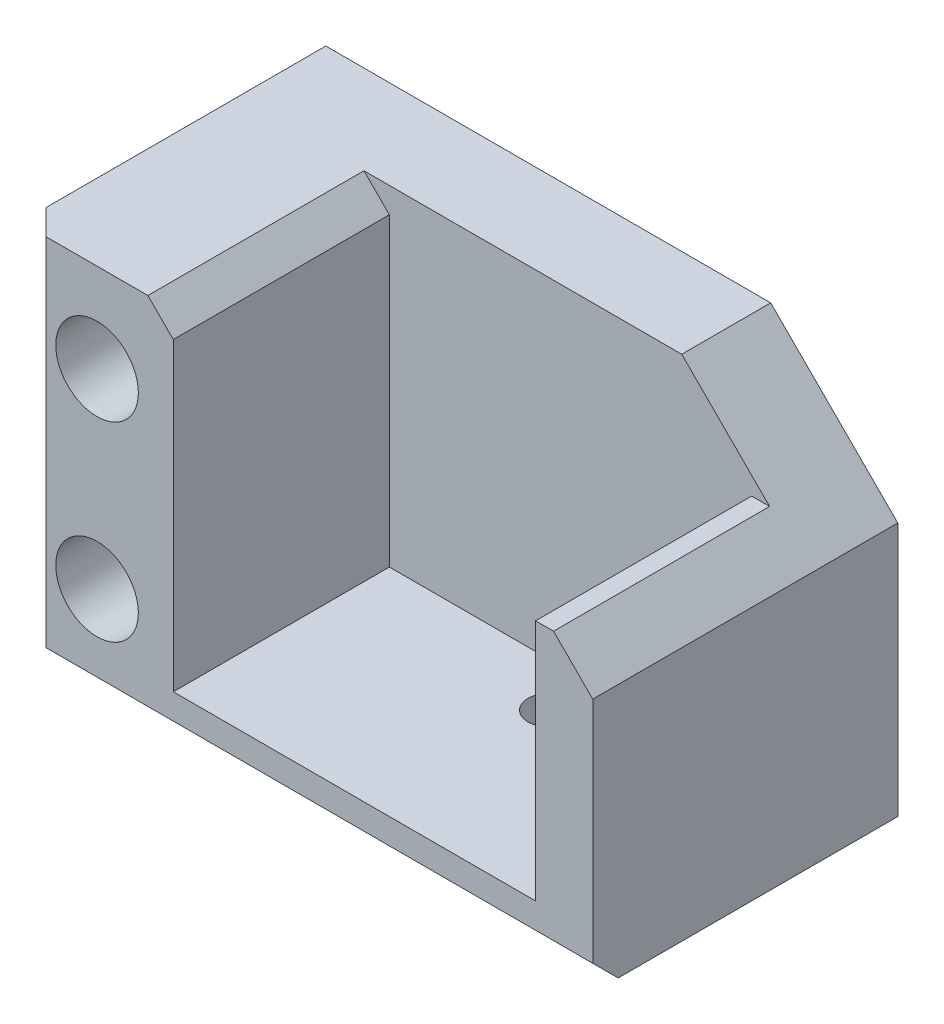
ISO-10303-21;
HEADER;
FILE_DESCRIPTION(('STEP AP214'),'2;1');
FILE_NAME('part.step','',(''),(''),'','','');
FILE_SCHEMA(('AUTOMOTIVE_DESIGN { 1 0 10303 214 1 1 1 1 }'));
ENDSEC;
DATA;
#1=APPLICATION_CONTEXT('core data for automotive mechanical design processes');
#2=APPLICATION_PROTOCOL_DEFINITION('international standard','automotive_design',2000,#1);
#3=PRODUCT_CONTEXT('',#1,'mechanical');
#4=PRODUCT('Part','Part','',(#3));
#5=PRODUCT_RELATED_PRODUCT_CATEGORY('part','',(#4));
#6=PRODUCT_DEFINITION_FORMATION('','',#4);
#7=PRODUCT_DEFINITION_CONTEXT('part definition',#1,'design');
#8=PRODUCT_DEFINITION('design','',#6,#7);
#9=PRODUCT_DEFINITION_SHAPE('','',#8);
#10=(LENGTH_UNIT() NAMED_UNIT(*) SI_UNIT(.MILLI.,.METRE.));
#11=(NAMED_UNIT(*) PLANE_ANGLE_UNIT() SI_UNIT($,.RADIAN.));
#12=(NAMED_UNIT(*) SI_UNIT($,.STERADIAN.) SOLID_ANGLE_UNIT());
#13=UNCERTAINTY_MEASURE_WITH_UNIT(LENGTH_MEASURE(1.E-05),#10,'distance_accuracy_value','');
#14=(GEOMETRIC_REPRESENTATION_CONTEXT(3) GLOBAL_UNCERTAINTY_ASSIGNED_CONTEXT((#13)) GLOBAL_UNIT_ASSIGNED_CONTEXT((#10,
#11,#12)) REPRESENTATION_CONTEXT('',''));
#15=CARTESIAN_POINT('',(0.,0.,0.));
#16=DIRECTION('',(0.,0.,1.));
#17=DIRECTION('',(1.,0.,0.));
#18=AXIS2_PLACEMENT_3D('',#15,#16,#17);
#19=CARTESIAN_POINT('',(6.00000202653794,6.00000000000019,-3.));
#20=DIRECTION('',(0.,-1.,0.));
#21=DIRECTION('',(1.,0.,0.));
#22=AXIS2_PLACEMENT_3D('',#19,#20,#21);
#23=PLANE('',#22);
#24=CARTESIAN_POINT('',(34.0000020265379,6.00000000000019,7.5));
#25=DIRECTION('',(0.,1.,0.));
#26=DIRECTION('',(0.,0.,1.));
#27=AXIS2_PLACEMENT_3D('',#24,#25,#26);
#28=CIRCLE('',#27,1.59999999999998);
#29=CARTESIAN_POINT('',(34.0000020265379,6.00000000000019,9.09999999999998));
#30=VERTEX_POINT('',#29);
#31=EDGE_CURVE('E272',#30,#30,#28,.T.);
#32=ORIENTED_EDGE('',*,*,#31,.T.);
#33=EDGE_LOOP('',(#32));
#34=FACE_BOUND('',#33,.T.);
#35=DIRECTION('',(0.,0.,1.));
#36=VECTOR('',#35,1.);
#37=CARTESIAN_POINT('',(51.0000020265379,6.00000000000023,-3.));
#38=LINE('',#37,#36);
#39=CARTESIAN_POINT('',(51.0000020265379,6.00000000000023,-3.));
#40=VERTEX_POINT('',#39);
#41=CARTESIAN_POINT('',(51.0000020265379,6.00000000000023,19.));
#42=VERTEX_POINT('',#41);
#43=EDGE_CURVE('E179',#40,#42,#38,.T.);
#44=ORIENTED_EDGE('',*,*,#43,.T.);
#45=DIRECTION('',(-1.,0.,0.));
#46=VECTOR('',#45,1.);
#47=CARTESIAN_POINT('',(6.00000202653794,6.00000000000019,19.));
#48=LINE('',#47,#46);
#49=CARTESIAN_POINT('',(6.00000202653794,6.00000000000019,19.));
#50=VERTEX_POINT('',#49);
#51=EDGE_CURVE('E207',#42,#50,#48,.T.);
#52=ORIENTED_EDGE('',*,*,#51,.T.);
#53=DIRECTION('',(0.,0.,1.));
#54=VECTOR('',#53,1.);
#55=CARTESIAN_POINT('',(6.00000202653794,6.00000000000019,-3.));
#56=LINE('',#55,#54);
#57=CARTESIAN_POINT('',(6.00000202653794,6.00000000000019,-3.));
#58=VERTEX_POINT('',#57);
#59=EDGE_CURVE('E183',#58,#50,#56,.T.);
#60=ORIENTED_EDGE('',*,*,#59,.F.);
#61=DIRECTION('',(1.,0.,0.));
#62=VECTOR('',#61,1.);
#63=CARTESIAN_POINT('',(6.00000202653794,6.00000000000019,-3.));
#64=LINE('',#63,#62);
#65=EDGE_CURVE('E167',#58,#40,#64,.T.);
#66=ORIENTED_EDGE('',*,*,#65,.T.);
#67=EDGE_LOOP('',(#44,#52,#60,#66));
#68=FACE_BOUND('',#67,.T.);
#69=ADVANCED_FACE('F33',(#34,#68),#23,.T.);
#70=CARTESIAN_POINT('',(6.00000202653794,36.0000000000002,-3.));
#71=DIRECTION('',(-1.,0.,0.));
#72=DIRECTION('',(0.,-1.,0.));
#73=AXIS2_PLACEMENT_3D('',#70,#71,#72);
#74=PLANE('',#73);
#75=ORIENTED_EDGE('',*,*,#59,.T.);
#76=DIRECTION('',(0.,1.,0.));
#77=VECTOR('',#76,1.);
#78=CARTESIAN_POINT('',(6.00000202653794,36.0000000000002,19.));
#79=LINE('',#78,#77);
#80=CARTESIAN_POINT('',(6.00000202653794,36.0000000000002,19.));
#81=VERTEX_POINT('',#80);
#82=EDGE_CURVE('E198',#50,#81,#79,.T.);
#83=ORIENTED_EDGE('',*,*,#82,.T.);
#84=DIRECTION('',(0.,0.,1.));
#85=VECTOR('',#84,1.);
#86=CARTESIAN_POINT('',(6.00000202653794,36.0000000000002,-3.));
#87=LINE('',#86,#85);
#88=CARTESIAN_POINT('',(6.00000202653794,36.0000000000002,-3.));
#89=VERTEX_POINT('',#88);
#90=EDGE_CURVE('E187',#89,#81,#87,.T.);
#91=ORIENTED_EDGE('',*,*,#90,.F.);
#92=DIRECTION('',(0.,-1.,0.));
#93=VECTOR('',#92,1.);
#94=CARTESIAN_POINT('',(6.00000202653794,36.0000000000002,-3.));
#95=LINE('',#94,#93);
#96=EDGE_CURVE('E176',#89,#58,#95,.T.);
#97=ORIENTED_EDGE('',*,*,#96,.T.);
#98=EDGE_LOOP('',(#75,#83,#91,#97));
#99=FACE_BOUND('',#98,.T.);
#100=ADVANCED_FACE('F254',(#99),#74,.T.);
#101=CARTESIAN_POINT('',(51.0000020265379,36.0000000000002,-3.));
#102=DIRECTION('',(0.,1.,0.));
#103=DIRECTION('',(0.,0.,1.));
#104=AXIS2_PLACEMENT_3D('',#101,#102,#103);
#105=PLANE('',#104);
#106=DIRECTION('',(1.,0.,0.));
#107=VECTOR('',#106,1.);
#108=CARTESIAN_POINT('',(18.0000020265379,36.0000000000002,4.));
#109=LINE('',#108,#107);
#110=CARTESIAN_POINT('',(16.0000020265379,36.0000000000002,4.));
#111=VERTEX_POINT('',#110);
#112=CARTESIAN_POINT('',(41.0000020265379,36.0000000000002,4.));
#113=VERTEX_POINT('',#112);
#114=EDGE_CURVE('E164',#111,#113,#109,.T.);
#115=ORIENTED_EDGE('',*,*,#114,.T.);
#116=DIRECTION('',(0.,0.,-1.));
#117=VECTOR('',#116,1.);
#118=CARTESIAN_POINT('',(41.0000020265379,36.0000000000002,-3.));
#119=LINE('',#118,#117);
#120=CARTESIAN_POINT('',(41.0000020265379,36.0000000000002,-3.));
#121=VERTEX_POINT('',#120);
#122=EDGE_CURVE('E41',#113,#121,#119,.T.);
#123=ORIENTED_EDGE('',*,*,#122,.T.);
#124=DIRECTION('',(-1.,0.,0.));
#125=VECTOR('',#124,1.);
#126=CARTESIAN_POINT('',(51.0000020265379,36.0000000000002,-3.));
#127=LINE('',#126,#125);
#128=EDGE_CURVE('E174',#121,#89,#127,.T.);
#129=ORIENTED_EDGE('',*,*,#128,.T.);
#130=ORIENTED_EDGE('',*,*,#90,.T.);
#131=DIRECTION('',(-0.707106781186542,0.,-0.707106781186553));
#132=VECTOR('',#131,1.);
#133=CARTESIAN_POINT('',(17.5000020265376,36.0000000000002,30.4999999999998));
#134=LINE('',#133,#132);
#135=CARTESIAN_POINT('',(8.00000202653792,36.0000000000002,21.));
#136=VERTEX_POINT('',#135);
#137=EDGE_CURVE('E203',#81,#136,#134,.F.);
#138=ORIENTED_EDGE('',*,*,#137,.T.);
#139=DIRECTION('',(-1.,0.,0.));
#140=VECTOR('',#139,1.);
#141=CARTESIAN_POINT('',(51.0000020265379,36.0000000000002,21.));
#142=LINE('',#141,#140);
#143=CARTESIAN_POINT('',(16.0000020265379,36.0000000000002,21.));
#144=VERTEX_POINT('',#143);
#145=EDGE_CURVE('E171',#144,#136,#142,.T.);
#146=ORIENTED_EDGE('',*,*,#145,.F.);
#147=DIRECTION('',(0.,0.,-1.));
#148=VECTOR('',#147,1.);
#149=CARTESIAN_POINT('',(16.0000020265379,36.0000000000002,-3.));
#150=LINE('',#149,#148);
#151=EDGE_CURVE('E200',#144,#111,#150,.T.);
#152=ORIENTED_EDGE('',*,*,#151,.T.);
#153=EDGE_LOOP('',(#115,#123,#129,#130,#138,#146,#152));
#154=FACE_BOUND('',#153,.T.);
#155=ADVANCED_FACE('F255',(#154),#105,.T.);
#156=CARTESIAN_POINT('',(51.0000020265379,6.00000000000023,-3.));
#157=DIRECTION('',(1.,0.,0.));
#158=DIRECTION('',(0.,0.,-1.));
#159=AXIS2_PLACEMENT_3D('',#156,#157,#158);
#160=PLANE('',#159);
#161=DIRECTION('',(0.,1.,0.));
#162=VECTOR('',#161,1.);
#163=CARTESIAN_POINT('',(51.0000020265379,6.00000000000023,-3.));
#164=LINE('',#163,#162);
#165=CARTESIAN_POINT('',(51.0000020265379,26.0000000000002,-3.));
#166=VERTEX_POINT('',#165);
#167=EDGE_CURVE('E170',#40,#166,#164,.T.);
#168=ORIENTED_EDGE('',*,*,#167,.T.);
#169=DIRECTION('',(0.,0.,1.));
#170=VECTOR('',#169,1.);
#171=CARTESIAN_POINT('',(51.0000020265379,26.0000000000002,-3.));
#172=LINE('',#171,#170);
#173=CARTESIAN_POINT('',(51.0000020265379,26.0000000000002,21.));
#174=VERTEX_POINT('',#173);
#175=EDGE_CURVE('E214',#166,#174,#172,.T.);
#176=ORIENTED_EDGE('',*,*,#175,.T.);
#177=DIRECTION('',(0.,1.,0.));
#178=VECTOR('',#177,1.);
#179=CARTESIAN_POINT('',(51.0000020265379,6.00000000000023,21.));
#180=LINE('',#179,#178);
#181=CARTESIAN_POINT('',(51.0000020265379,8.00000000000021,21.));
#182=VERTEX_POINT('',#181);
#183=EDGE_CURVE('E163',#182,#174,#180,.T.);
#184=ORIENTED_EDGE('',*,*,#183,.F.);
#185=DIRECTION('',(0.,0.707106781186543,0.707106781186552));
#186=VECTOR('',#185,1.);
#187=CARTESIAN_POINT('',(51.0000020265379,-4.99999999999977,7.99999999999985));
#188=LINE('',#187,#186);
#189=EDGE_CURVE('E205',#182,#42,#188,.F.);
#190=ORIENTED_EDGE('',*,*,#189,.T.);
#191=ORIENTED_EDGE('',*,*,#43,.F.);
#192=EDGE_LOOP('',(#168,#176,#184,#190,#191));
#193=FACE_BOUND('',#192,.T.);
#194=ADVANCED_FACE('F238',(#193),#160,.T.);
#195=CARTESIAN_POINT('',(0.,0.,-3.));
#196=DIRECTION('',(0.,0.,1.));
#197=DIRECTION('',(1.,0.,0.));
#198=AXIS2_PLACEMENT_3D('',#195,#196,#197);
#199=PLANE('',#198);
#200=CARTESIAN_POINT('',(12.0000020265379,29.0000000000002,-3.));
#201=DIRECTION('',(0.,0.,1.));
#202=DIRECTION('',(1.,0.,0.));
#203=AXIS2_PLACEMENT_3D('',#200,#201,#202);
#204=CIRCLE('',#203,1.69999999999999);
#205=CARTESIAN_POINT('',(13.7000020265379,29.0000000000002,-3.));
#206=VERTEX_POINT('',#205);
#207=EDGE_CURVE('E290',#206,#206,#204,.T.);
#208=ORIENTED_EDGE('',*,*,#207,.T.);
#209=EDGE_LOOP('',(#208));
#210=FACE_BOUND('',#209,.T.);
#211=CARTESIAN_POINT('',(12.0000020265379,14.0000000000002,-3.));
#212=DIRECTION('',(0.,0.,1.));
#213=DIRECTION('',(1.,0.,0.));
#214=AXIS2_PLACEMENT_3D('',#211,#212,#213);
#215=CIRCLE('',#214,1.69999999999999);
#216=CARTESIAN_POINT('',(13.7000020265379,14.0000000000002,-3.));
#217=VERTEX_POINT('',#216);
#218=EDGE_CURVE('E278',#217,#217,#215,.T.);
#219=ORIENTED_EDGE('',*,*,#218,.T.);
#220=EDGE_LOOP('',(#219));
#221=FACE_BOUND('',#220,.T.);
#222=CARTESIAN_POINT('',(42.0000020265379,14.0000000000002,-3.));
#223=DIRECTION('',(0.,0.,1.));
#224=DIRECTION('',(1.,0.,0.));
#225=AXIS2_PLACEMENT_3D('',#222,#223,#224);
#226=CIRCLE('',#225,1.6);
#227=CARTESIAN_POINT('',(43.6000020265379,14.0000000000002,-3.));
#228=VERTEX_POINT('',#227);
#229=EDGE_CURVE('E135',#228,#228,#226,.T.);
#230=ORIENTED_EDGE('',*,*,#229,.T.);
#231=EDGE_LOOP('',(#230));
#232=FACE_BOUND('',#231,.T.);
#233=ORIENTED_EDGE('',*,*,#128,.F.);
#234=DIRECTION('',(-0.70710678118655,0.707106781186545,0.));
#235=VECTOR('',#234,1.);
#236=CARTESIAN_POINT('',(51.0000020265379,26.0000000000002,-3.));
#237=LINE('',#236,#235);
#238=EDGE_CURVE('E11',#121,#166,#237,.F.);
#239=ORIENTED_EDGE('',*,*,#238,.T.);
#240=ORIENTED_EDGE('',*,*,#167,.F.);
#241=ORIENTED_EDGE('',*,*,#65,.F.);
#242=ORIENTED_EDGE('',*,*,#96,.F.);
#243=EDGE_LOOP('',(#233,#239,#240,#241,#242));
#244=FACE_BOUND('',#243,.T.);
#245=ADVANCED_FACE('F234',(#210,#221,#232,#244),#199,.F.);
#246=CARTESIAN_POINT('',(0.,0.,21.));
#247=DIRECTION('',(0.,0.,1.));
#248=DIRECTION('',(1.,0.,0.));
#249=AXIS2_PLACEMENT_3D('',#246,#247,#248);
#250=PLANE('',#249);
#251=CARTESIAN_POINT('',(12.0000020265379,29.0000000000002,21.));
#252=DIRECTION('',(0.,0.,1.));
#253=DIRECTION('',(1.,0.,0.));
#254=AXIS2_PLACEMENT_3D('',#251,#252,#253);
#255=CIRCLE('',#254,3.24999999999999);
#256=CARTESIAN_POINT('',(15.2500020265379,29.0000000000002,21.));
#257=VERTEX_POINT('',#256);
#258=EDGE_CURVE('E217',#257,#257,#255,.T.);
#259=ORIENTED_EDGE('',*,*,#258,.F.);
#260=EDGE_LOOP('',(#259));
#261=FACE_BOUND('',#260,.T.);
#262=CARTESIAN_POINT('',(12.0000020265379,14.0000000000002,21.));
#263=DIRECTION('',(0.,0.,1.));
#264=DIRECTION('',(1.,0.,0.));
#265=AXIS2_PLACEMENT_3D('',#262,#263,#264);
#266=CIRCLE('',#265,3.24999999999999);
#267=CARTESIAN_POINT('',(15.2500020265379,14.0000000000002,21.));
#268=VERTEX_POINT('',#267);
#269=EDGE_CURVE('E287',#268,#268,#266,.T.);
#270=ORIENTED_EDGE('',*,*,#269,.F.);
#271=EDGE_LOOP('',(#270));
#272=FACE_BOUND('',#271,.T.);
#273=ORIENTED_EDGE('',*,*,#183,.T.);
#274=DIRECTION('',(0.70710678118655,-0.707106781186545,0.));
#275=VECTOR('',#274,1.);
#276=CARTESIAN_POINT('',(38.5000010132689,38.5000010132692,21.));
#277=LINE('',#276,#275);
#278=CARTESIAN_POINT('',(47.914215588911,29.0857864376271,21.));
#279=VERTEX_POINT('',#278);
#280=EDGE_CURVE('E220',#174,#279,#277,.F.);
#281=ORIENTED_EDGE('',*,*,#280,.T.);
#282=DIRECTION('',(1.,0.,0.));
#283=VECTOR('',#282,1.);
#284=CARTESIAN_POINT('',(18.0000020265379,29.0857864376271,21.));
#285=LINE('',#284,#283);
#286=CARTESIAN_POINT('',(46.5000020265379,29.0857864376272,21.));
#287=VERTEX_POINT('',#286);
#288=EDGE_CURVE('E150',#287,#279,#285,.T.);
#289=ORIENTED_EDGE('',*,*,#288,.F.);
#290=DIRECTION('',(0.,-1.,0.));
#291=VECTOR('',#290,1.);
#292=CARTESIAN_POINT('',(46.500002026538,62.2708734497174,21.));
#293=LINE('',#292,#291);
#294=CARTESIAN_POINT('',(46.5000020265379,10.0000000000002,21.));
#295=VERTEX_POINT('',#294);
#296=EDGE_CURVE('E139',#287,#295,#293,.T.);
#297=ORIENTED_EDGE('',*,*,#296,.T.);
#298=DIRECTION('',(-1.,0.,0.));
#299=VECTOR('',#298,1.);
#300=CARTESIAN_POINT('',(46.5000020265379,10.0000000000002,21.));
#301=LINE('',#300,#299);
#302=CARTESIAN_POINT('',(18.0000020265379,10.0000000000002,21.));
#303=VERTEX_POINT('',#302);
#304=EDGE_CURVE('E125',#295,#303,#301,.T.);
#305=ORIENTED_EDGE('',*,*,#304,.T.);
#306=DIRECTION('',(0.,-1.,0.));
#307=VECTOR('',#306,1.);
#308=CARTESIAN_POINT('',(18.0000020265379,36.0000000000002,21.));
#309=LINE('',#308,#307);
#310=CARTESIAN_POINT('',(18.0000020265379,34.0000000000002,21.));
#311=VERTEX_POINT('',#310);
#312=EDGE_CURVE('E155',#311,#303,#309,.T.);
#313=ORIENTED_EDGE('',*,*,#312,.F.);
#314=DIRECTION('',(0.707106781186552,-0.707106781186543,0.));
#315=VECTOR('',#314,1.);
#316=CARTESIAN_POINT('',(26.0000010132689,26.0000010132693,21.));
#317=LINE('',#316,#315);
#318=EDGE_CURVE('E186',#311,#144,#317,.F.);
#319=ORIENTED_EDGE('',*,*,#318,.T.);
#320=ORIENTED_EDGE('',*,*,#145,.T.);
#321=DIRECTION('',(0.,-1.,0.));
#322=VECTOR('',#321,1.);
#323=CARTESIAN_POINT('',(8.00000202653792,0.,21.));
#324=LINE('',#323,#322);
#325=CARTESIAN_POINT('',(8.00000202653792,8.00000000000018,21.));
#326=VERTEX_POINT('',#325);
#327=EDGE_CURVE('E195',#136,#326,#324,.T.);
#328=ORIENTED_EDGE('',*,*,#327,.T.);
#329=DIRECTION('',(1.,0.,0.));
#330=VECTOR('',#329,1.);
#331=CARTESIAN_POINT('',(0.,8.00000000000017,21.));
#332=LINE('',#331,#330);
#333=EDGE_CURVE('E193',#326,#182,#332,.T.);
#334=ORIENTED_EDGE('',*,*,#333,.T.);
#335=EDGE_LOOP('',(#273,#281,#289,#297,#305,#313,#319,#320,#328,#334));
#336=FACE_BOUND('',#335,.T.);
#337=ADVANCED_FACE('F148',(#261,#272,#336),#250,.T.);
#338=CARTESIAN_POINT('',(18.0000020265379,29.0857864376271,21.));
#339=DIRECTION('',(0.,-1.,0.));
#340=DIRECTION('',(0.,0.,-1.));
#341=AXIS2_PLACEMENT_3D('',#338,#339,#340);
#342=PLANE('',#341);
#343=ORIENTED_EDGE('',*,*,#288,.T.);
#344=DIRECTION('',(0.,0.,1.));
#345=VECTOR('',#344,1.);
#346=CARTESIAN_POINT('',(47.914215588911,29.0857864376271,-3.));
#347=LINE('',#346,#345);
#348=CARTESIAN_POINT('',(47.914215588911,29.0857864376271,4.));
#349=VERTEX_POINT('',#348);
#350=EDGE_CURVE('E222',#279,#349,#347,.F.);
#351=ORIENTED_EDGE('',*,*,#350,.T.);
#352=DIRECTION('',(1.,0.,0.));
#353=VECTOR('',#352,1.);
#354=CARTESIAN_POINT('',(18.0000020265379,29.0857864376271,4.));
#355=LINE('',#354,#353);
#356=CARTESIAN_POINT('',(46.500002026538,29.0857864376272,4.));
#357=VERTEX_POINT('',#356);
#358=EDGE_CURVE('E161',#357,#349,#355,.T.);
#359=ORIENTED_EDGE('',*,*,#358,.F.);
#360=DIRECTION('',(0.,0.,1.));
#361=VECTOR('',#360,1.);
#362=CARTESIAN_POINT('',(46.5000020265379,29.0857864376272,4.));
#363=LINE('',#362,#361);
#364=EDGE_CURVE('E152',#357,#287,#363,.T.);
#365=ORIENTED_EDGE('',*,*,#364,.T.);
#366=EDGE_LOOP('',(#343,#351,#359,#365));
#367=FACE_BOUND('',#366,.T.);
#368=ADVANCED_FACE('F227',(#367),#342,.F.);
#369=CARTESIAN_POINT('',(18.0000020265379,29.0857864376271,4.));
#370=DIRECTION('',(0.,0.,-1.));
#371=DIRECTION('',(-1.,0.,0.));
#372=AXIS2_PLACEMENT_3D('',#369,#370,#371);
#373=PLANE('',#372);
#374=CARTESIAN_POINT('',(42.0000020265379,14.0000000000002,4.));
#375=DIRECTION('',(0.,0.,1.));
#376=DIRECTION('',(1.,0.,0.));
#377=AXIS2_PLACEMENT_3D('',#374,#375,#376);
#378=CIRCLE('',#377,1.59999999999998);
#379=CARTESIAN_POINT('',(43.6000020265379,14.0000000000002,4.));
#380=VERTEX_POINT('',#379);
#381=EDGE_CURVE('E269',#380,#380,#378,.T.);
#382=ORIENTED_EDGE('',*,*,#381,.F.);
#383=EDGE_LOOP('',(#382));
#384=FACE_BOUND('',#383,.T.);
#385=ORIENTED_EDGE('',*,*,#358,.T.);
#386=DIRECTION('',(0.70710678118655,-0.707106781186545,0.));
#387=VECTOR('',#386,1.);
#388=CARTESIAN_POINT('',(51.0000020265379,26.0000000000002,4.));
#389=LINE('',#388,#387);
#390=EDGE_CURVE('E55',#349,#113,#389,.F.);
#391=ORIENTED_EDGE('',*,*,#390,.T.);
#392=ORIENTED_EDGE('',*,*,#114,.F.);
#393=DIRECTION('',(-0.707106781186552,0.707106781186543,0.));
#394=VECTOR('',#393,1.);
#395=CARTESIAN_POINT('',(20.4571088077245,31.5428932188137,4.));
#396=LINE('',#395,#394);
#397=CARTESIAN_POINT('',(18.0000020265379,34.0000000000002,4.));
#398=VERTEX_POINT('',#397);
#399=EDGE_CURVE('E212',#111,#398,#396,.F.);
#400=ORIENTED_EDGE('',*,*,#399,.T.);
#401=DIRECTION('',(0.,1.,0.));
#402=VECTOR('',#401,1.);
#403=CARTESIAN_POINT('',(18.0000020265379,29.0857864376271,4.));
#404=LINE('',#403,#402);
#405=CARTESIAN_POINT('',(18.0000020265379,10.0000000000002,4.));
#406=VERTEX_POINT('',#405);
#407=EDGE_CURVE('E151',#406,#398,#404,.T.);
#408=ORIENTED_EDGE('',*,*,#407,.F.);
#409=DIRECTION('',(1.,0.,0.));
#410=VECTOR('',#409,1.);
#411=CARTESIAN_POINT('',(18.0000020265379,10.0000000000002,4.));
#412=LINE('',#411,#410);
#413=CARTESIAN_POINT('',(46.5000020265379,10.0000000000002,4.));
#414=VERTEX_POINT('',#413);
#415=EDGE_CURVE('E144',#406,#414,#412,.T.);
#416=ORIENTED_EDGE('',*,*,#415,.T.);
#417=DIRECTION('',(0.,-1.,0.));
#418=VECTOR('',#417,1.);
#419=CARTESIAN_POINT('',(46.500002026538,62.2708734497174,4.));
#420=LINE('',#419,#418);
#421=EDGE_CURVE('E142',#357,#414,#420,.T.);
#422=ORIENTED_EDGE('',*,*,#421,.F.);
#423=EDGE_LOOP('',(#385,#391,#392,#400,#408,#416,#422));
#424=FACE_BOUND('',#423,.T.);
#425=ADVANCED_FACE('F229',(#384,#424),#373,.F.);
#426=CARTESIAN_POINT('',(18.0000020265379,0.,0.));
#427=DIRECTION('',(1.,0.,0.));
#428=DIRECTION('',(0.,0.,-1.));
#429=AXIS2_PLACEMENT_3D('',#426,#427,#428);
#430=PLANE('',#429);
#431=ORIENTED_EDGE('',*,*,#407,.T.);
#432=DIRECTION('',(0.,0.,1.));
#433=VECTOR('',#432,1.);
#434=CARTESIAN_POINT('',(18.0000020265379,34.0000000000002,0.));
#435=LINE('',#434,#433);
#436=EDGE_CURVE('E209',#398,#311,#435,.T.);
#437=ORIENTED_EDGE('',*,*,#436,.T.);
#438=ORIENTED_EDGE('',*,*,#312,.T.);
#439=DIRECTION('',(0.,0.,-1.));
#440=VECTOR('',#439,1.);
#441=CARTESIAN_POINT('',(18.0000020265379,10.0000000000002,21.));
#442=LINE('',#441,#440);
#443=EDGE_CURVE('E131',#303,#406,#442,.T.);
#444=ORIENTED_EDGE('',*,*,#443,.T.);
#445=EDGE_LOOP('',(#431,#437,#438,#444));
#446=FACE_BOUND('',#445,.T.);
#447=ADVANCED_FACE('F263',(#446),#430,.T.);
#448=CARTESIAN_POINT('',(0.,10.0000000000002,0.));
#449=DIRECTION('',(0.,-1.,0.));
#450=DIRECTION('',(1.,0.,0.));
#451=AXIS2_PLACEMENT_3D('',#448,#449,#450);
#452=PLANE('',#451);
#453=CARTESIAN_POINT('',(34.0000020265379,10.0000000000002,7.5));
#454=DIRECTION('',(0.,1.,0.));
#455=DIRECTION('',(0.,0.,1.));
#456=AXIS2_PLACEMENT_3D('',#453,#454,#455);
#457=CIRCLE('',#456,1.59999999999998);
#458=CARTESIAN_POINT('',(34.0000020265379,10.0000000000002,9.09999999999998));
#459=VERTEX_POINT('',#458);
#460=EDGE_CURVE('E275',#459,#459,#457,.T.);
#461=ORIENTED_EDGE('',*,*,#460,.F.);
#462=EDGE_LOOP('',(#461));
#463=FACE_BOUND('',#462,.T.);
#464=ORIENTED_EDGE('',*,*,#304,.F.);
#465=DIRECTION('',(0.,0.,1.));
#466=VECTOR('',#465,1.);
#467=CARTESIAN_POINT('',(46.5000020265379,10.0000000000002,4.));
#468=LINE('',#467,#466);
#469=EDGE_CURVE('E129',#414,#295,#468,.T.);
#470=ORIENTED_EDGE('',*,*,#469,.F.);
#471=ORIENTED_EDGE('',*,*,#415,.F.);
#472=ORIENTED_EDGE('',*,*,#443,.F.);
#473=EDGE_LOOP('',(#464,#470,#471,#472));
#474=FACE_BOUND('',#473,.T.);
#475=ADVANCED_FACE('F127',(#463,#474),#452,.F.);
#476=CARTESIAN_POINT('',(46.500002026538,62.2708734497174,4.));
#477=DIRECTION('',(1.,0.,0.));
#478=DIRECTION('',(0.,1.,0.));
#479=AXIS2_PLACEMENT_3D('',#476,#477,#478);
#480=PLANE('',#479);
#481=ORIENTED_EDGE('',*,*,#421,.T.);
#482=ORIENTED_EDGE('',*,*,#469,.T.);
#483=ORIENTED_EDGE('',*,*,#296,.F.);
#484=ORIENTED_EDGE('',*,*,#364,.F.);
#485=EDGE_LOOP('',(#481,#482,#483,#484));
#486=FACE_BOUND('',#485,.T.);
#487=ADVANCED_FACE('F138',(#486),#480,.F.);
#488=CARTESIAN_POINT('',(42.0000020265379,14.0000000000002,4.));
#489=DIRECTION('',(0.,0.,1.));
#490=DIRECTION('',(1.,0.,0.));
#491=AXIS2_PLACEMENT_3D('',#488,#489,#490);
#492=CYLINDRICAL_SURFACE('',#491,1.59999999999999);
#493=ORIENTED_EDGE('',*,*,#229,.F.);
#494=EDGE_LOOP('',(#493));
#495=FACE_BOUND('',#494,.T.);
#496=ORIENTED_EDGE('',*,*,#381,.T.);
#497=EDGE_LOOP('',(#496));
#498=FACE_BOUND('',#497,.T.);
#499=ADVANCED_FACE('F482',(#495,#498),#492,.F.);
#500=CARTESIAN_POINT('',(34.0000020265379,10.0000000000002,7.5));
#501=DIRECTION('',(0.,1.,0.));
#502=DIRECTION('',(0.,0.,1.));
#503=AXIS2_PLACEMENT_3D('',#500,#501,#502);
#504=CYLINDRICAL_SURFACE('',#503,1.59999999999998);
#505=ORIENTED_EDGE('',*,*,#31,.F.);
#506=EDGE_LOOP('',(#505));
#507=FACE_BOUND('',#506,.T.);
#508=ORIENTED_EDGE('',*,*,#460,.T.);
#509=EDGE_LOOP('',(#508));
#510=FACE_BOUND('',#509,.T.);
#511=ADVANCED_FACE('F472',(#507,#510),#504,.F.);
#512=CARTESIAN_POINT('',(12.0000020265379,14.0000000000002,21.));
#513=DIRECTION('',(0.,0.,1.));
#514=DIRECTION('',(1.,0.,0.));
#515=AXIS2_PLACEMENT_3D('',#512,#513,#514);
#516=CYLINDRICAL_SURFACE('',#515,1.7);
#517=ORIENTED_EDGE('',*,*,#218,.F.);
#518=EDGE_LOOP('',(#517));
#519=FACE_BOUND('',#518,.T.);
#520=CARTESIAN_POINT('',(12.0000020265379,14.0000000000002,6.));
#521=DIRECTION('',(0.,0.,1.));
#522=DIRECTION('',(1.,0.,0.));
#523=AXIS2_PLACEMENT_3D('',#520,#521,#522);
#524=CIRCLE('',#523,1.70000000000001);
#525=CARTESIAN_POINT('',(13.7000020265379,14.0000000000002,6.));
#526=VERTEX_POINT('',#525);
#527=EDGE_CURVE('E281',#526,#526,#524,.T.);
#528=ORIENTED_EDGE('',*,*,#527,.T.);
#529=EDGE_LOOP('',(#528));
#530=FACE_BOUND('',#529,.T.);
#531=ADVANCED_FACE('F322',(#519,#530),#516,.F.);
#532=CARTESIAN_POINT('',(13.7000020265379,14.0000000000002,6.));
#533=DIRECTION('',(0.,0.,-1.));
#534=DIRECTION('',(-1.,0.,0.));
#535=AXIS2_PLACEMENT_3D('',#532,#533,#534);
#536=PLANE('',#535);
#537=ORIENTED_EDGE('',*,*,#527,.F.);
#538=EDGE_LOOP('',(#537));
#539=FACE_BOUND('',#538,.T.);
#540=CARTESIAN_POINT('',(12.0000020265379,14.0000000000002,6.));
#541=DIRECTION('',(0.,0.,1.));
#542=DIRECTION('',(1.,0.,0.));
#543=AXIS2_PLACEMENT_3D('',#540,#541,#542);
#544=CIRCLE('',#543,3.24999999999999);
#545=CARTESIAN_POINT('',(15.2500020265379,14.0000000000002,6.));
#546=VERTEX_POINT('',#545);
#547=EDGE_CURVE('E284',#546,#546,#544,.T.);
#548=ORIENTED_EDGE('',*,*,#547,.T.);
#549=EDGE_LOOP('',(#548));
#550=FACE_BOUND('',#549,.T.);
#551=ADVANCED_FACE('F312',(#539,#550),#536,.F.);
#552=CARTESIAN_POINT('',(12.0000020265379,14.0000000000002,21.));
#553=DIRECTION('',(0.,0.,1.));
#554=DIRECTION('',(1.,0.,0.));
#555=AXIS2_PLACEMENT_3D('',#552,#553,#554);
#556=CYLINDRICAL_SURFACE('',#555,3.24999999999999);
#557=ORIENTED_EDGE('',*,*,#547,.F.);
#558=EDGE_LOOP('',(#557));
#559=FACE_BOUND('',#558,.T.);
#560=ORIENTED_EDGE('',*,*,#269,.T.);
#561=EDGE_LOOP('',(#560));
#562=FACE_BOUND('',#561,.T.);
#563=ADVANCED_FACE('F309',(#559,#562),#556,.F.);
#564=CARTESIAN_POINT('',(12.0000020265379,29.0000000000002,21.));
#565=DIRECTION('',(0.,0.,1.));
#566=DIRECTION('',(1.,0.,0.));
#567=AXIS2_PLACEMENT_3D('',#564,#565,#566);
#568=CYLINDRICAL_SURFACE('',#567,1.7);
#569=ORIENTED_EDGE('',*,*,#207,.F.);
#570=EDGE_LOOP('',(#569));
#571=FACE_BOUND('',#570,.T.);
#572=CARTESIAN_POINT('',(12.0000020265379,29.0000000000002,6.));
#573=DIRECTION('',(0.,0.,1.));
#574=DIRECTION('',(1.,0.,0.));
#575=AXIS2_PLACEMENT_3D('',#572,#573,#574);
#576=CIRCLE('',#575,1.70000000000001);
#577=CARTESIAN_POINT('',(13.7000020265379,29.0000000000002,6.));
#578=VERTEX_POINT('',#577);
#579=EDGE_CURVE('E293',#578,#578,#576,.T.);
#580=ORIENTED_EDGE('',*,*,#579,.T.);
#581=EDGE_LOOP('',(#580));
#582=FACE_BOUND('',#581,.T.);
#583=ADVANCED_FACE('F311',(#571,#582),#568,.F.);
#584=CARTESIAN_POINT('',(13.7000020265379,29.0000000000002,6.));
#585=DIRECTION('',(0.,0.,-1.));
#586=DIRECTION('',(-1.,0.,0.));
#587=AXIS2_PLACEMENT_3D('',#584,#585,#586);
#588=PLANE('',#587);
#589=ORIENTED_EDGE('',*,*,#579,.F.);
#590=EDGE_LOOP('',(#589));
#591=FACE_BOUND('',#590,.T.);
#592=CARTESIAN_POINT('',(12.0000020265379,29.0000000000002,6.));
#593=DIRECTION('',(0.,0.,1.));
#594=DIRECTION('',(1.,0.,0.));
#595=AXIS2_PLACEMENT_3D('',#592,#593,#594);
#596=CIRCLE('',#595,3.24999999999999);
#597=CARTESIAN_POINT('',(15.2500020265379,29.0000000000002,6.));
#598=VERTEX_POINT('',#597);
#599=EDGE_CURVE('E296',#598,#598,#596,.T.);
#600=ORIENTED_EDGE('',*,*,#599,.T.);
#601=EDGE_LOOP('',(#600));
#602=FACE_BOUND('',#601,.T.);
#603=ADVANCED_FACE('F319',(#591,#602),#588,.F.);
#604=CARTESIAN_POINT('',(12.0000020265379,29.0000000000002,21.));
#605=DIRECTION('',(0.,0.,1.));
#606=DIRECTION('',(1.,0.,0.));
#607=AXIS2_PLACEMENT_3D('',#604,#605,#606);
#608=CYLINDRICAL_SURFACE('',#607,3.24999999999999);
#609=ORIENTED_EDGE('',*,*,#599,.F.);
#610=EDGE_LOOP('',(#609));
#611=FACE_BOUND('',#610,.T.);
#612=ORIENTED_EDGE('',*,*,#258,.T.);
#613=EDGE_LOOP('',(#612));
#614=FACE_BOUND('',#613,.T.);
#615=ADVANCED_FACE('F302',(#611,#614),#608,.F.);
#616=CARTESIAN_POINT('',(0.,8.00000000000017,21.));
#617=DIRECTION('',(0.,0.707106781186552,-0.707106781186543));
#618=DIRECTION('',(1.,0.,0.));
#619=AXIS2_PLACEMENT_3D('',#616,#617,#618);
#620=PLANE('',#619);
#621=ORIENTED_EDGE('',*,*,#189,.F.);
#622=ORIENTED_EDGE('',*,*,#333,.F.);
#623=DIRECTION('',(-0.577350269189623,-0.577350269189624,-0.577350269189631));
#624=VECTOR('',#623,1.);
#625=CARTESIAN_POINT('',(5.33333468435864,5.33333265782089,18.3333326578207));
#626=LINE('',#625,#624);
#627=EDGE_CURVE('E215',#50,#326,#626,.F.);
#628=ORIENTED_EDGE('',*,*,#627,.F.);
#629=ORIENTED_EDGE('',*,*,#51,.F.);
#630=EDGE_LOOP('',(#621,#622,#628,#629));
#631=FACE_BOUND('',#630,.T.);
#632=ADVANCED_FACE('F245',(#631),#620,.F.);
#633=CARTESIAN_POINT('',(8.00000202653792,0.,21.));
#634=DIRECTION('',(0.707106781186553,0.,-0.707106781186543));
#635=DIRECTION('',(0.,-1.,0.));
#636=AXIS2_PLACEMENT_3D('',#633,#634,#635);
#637=PLANE('',#636);
#638=ORIENTED_EDGE('',*,*,#137,.F.);
#639=ORIENTED_EDGE('',*,*,#82,.F.);
#640=ORIENTED_EDGE('',*,*,#627,.T.);
#641=ORIENTED_EDGE('',*,*,#327,.F.);
#642=EDGE_LOOP('',(#638,#639,#640,#641));
#643=FACE_BOUND('',#642,.T.);
#644=ADVANCED_FACE('F251',(#643),#637,.F.);
#645=CARTESIAN_POINT('',(18.0000020265379,34.0000000000002,0.));
#646=DIRECTION('',(-0.707106781186543,-0.707106781186552,0.));
#647=DIRECTION('',(0.,0.,1.));
#648=AXIS2_PLACEMENT_3D('',#645,#646,#647);
#649=PLANE('',#648);
#650=ORIENTED_EDGE('',*,*,#399,.F.);
#651=ORIENTED_EDGE('',*,*,#151,.F.);
#652=ORIENTED_EDGE('',*,*,#318,.F.);
#653=ORIENTED_EDGE('',*,*,#436,.F.);
#654=EDGE_LOOP('',(#650,#651,#652,#653));
#655=FACE_BOUND('',#654,.T.);
#656=ADVANCED_FACE('F261',(#655),#649,.F.);
#657=CARTESIAN_POINT('',(51.0000020265379,26.0000000000002,-3.));
#658=DIRECTION('',(-0.707106781186545,-0.70710678118655,0.));
#659=DIRECTION('',(0.,0.,1.));
#660=AXIS2_PLACEMENT_3D('',#657,#658,#659);
#661=PLANE('',#660);
#662=ORIENTED_EDGE('',*,*,#238,.F.);
#663=ORIENTED_EDGE('',*,*,#122,.F.);
#664=ORIENTED_EDGE('',*,*,#390,.F.);
#665=ORIENTED_EDGE('',*,*,#350,.F.);
#666=ORIENTED_EDGE('',*,*,#280,.F.);
#667=ORIENTED_EDGE('',*,*,#175,.F.);
#668=EDGE_LOOP('',(#662,#663,#664,#665,#666,#667));
#669=FACE_BOUND('',#668,.T.);
#670=ADVANCED_FACE('F35',(#669),#661,.F.);
#671=CLOSED_SHELL('',(#69,#100,#155,#194,#245,#337,#368,#425,#447,#475,#487,#499,#511,#531,#551,
#563,#583,#603,#615,#632,#644,#656,#670));
#672=MANIFOLD_SOLID_BREP('B2',#671);
#673=ADVANCED_BREP_SHAPE_REPRESENTATION('',(#18,#672),#14);
#674=SHAPE_DEFINITION_REPRESENTATION(#9,#673);
ENDSEC;
END-ISO-10303-21;
